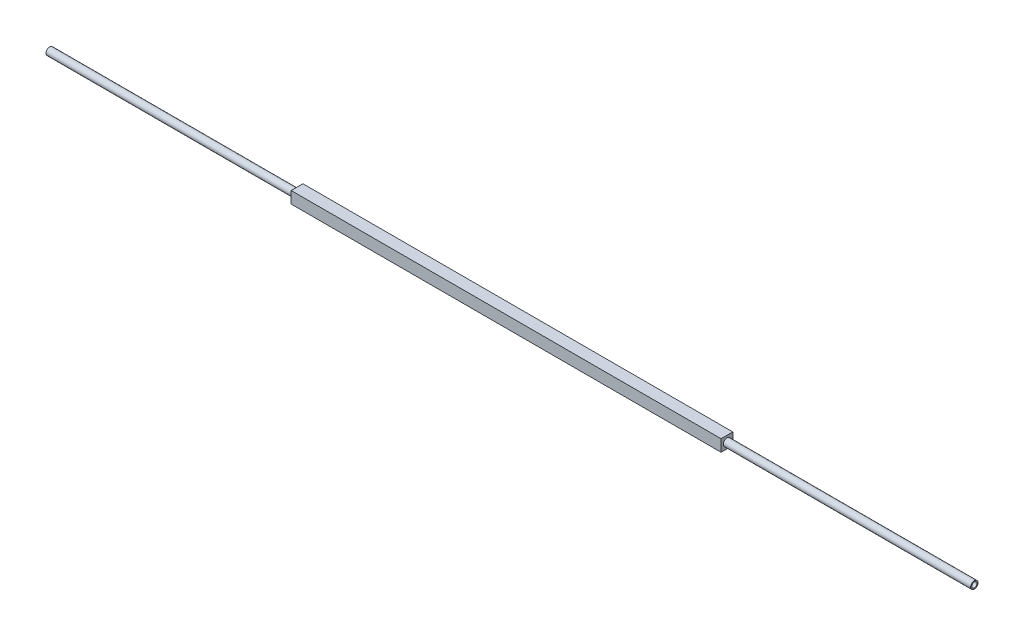
ISO-10303-21;
HEADER;
FILE_DESCRIPTION(('STEP AP214'),'2;1');
FILE_NAME('part.step','',(''),(''),'','','');
FILE_SCHEMA(('AUTOMOTIVE_DESIGN { 1 0 10303 214 1 1 1 1 }'));
ENDSEC;
DATA;
#1=APPLICATION_CONTEXT('core data for automotive mechanical design processes');
#2=APPLICATION_PROTOCOL_DEFINITION('international standard','automotive_design',2000,#1);
#3=PRODUCT_CONTEXT('',#1,'mechanical');
#4=PRODUCT('Part','Part','',(#3));
#5=PRODUCT_RELATED_PRODUCT_CATEGORY('part','',(#4));
#6=PRODUCT_DEFINITION_FORMATION('','',#4);
#7=PRODUCT_DEFINITION_CONTEXT('part definition',#1,'design');
#8=PRODUCT_DEFINITION('design','',#6,#7);
#9=PRODUCT_DEFINITION_SHAPE('','',#8);
#10=(LENGTH_UNIT() NAMED_UNIT(*) SI_UNIT(.MILLI.,.METRE.));
#11=(NAMED_UNIT(*) PLANE_ANGLE_UNIT() SI_UNIT($,.RADIAN.));
#12=(NAMED_UNIT(*) SI_UNIT($,.STERADIAN.) SOLID_ANGLE_UNIT());
#13=UNCERTAINTY_MEASURE_WITH_UNIT(LENGTH_MEASURE(1.E-05),#10,'distance_accuracy_value','');
#14=(GEOMETRIC_REPRESENTATION_CONTEXT(3) GLOBAL_UNCERTAINTY_ASSIGNED_CONTEXT((#13)) GLOBAL_UNIT_ASSIGNED_CONTEXT((#10,
#11,#12)) REPRESENTATION_CONTEXT('',''));
#15=CARTESIAN_POINT('',(0.,0.,0.));
#16=DIRECTION('',(0.,0.,1.));
#17=DIRECTION('',(1.,0.,0.));
#18=AXIS2_PLACEMENT_3D('',#15,#16,#17);
#19=CARTESIAN_POINT('',(-116.205,0.,0.));
#20=DIRECTION('',(0.,0.,1.));
#21=DIRECTION('',(1.,0.,0.));
#22=AXIS2_PLACEMENT_3D('',#19,#20,#21);
#23=PLANE('',#22);
#24=DIRECTION('',(1.,0.,0.));
#25=VECTOR('',#24,1.);
#26=CARTESIAN_POINT('',(-116.205,0.,0.));
#27=LINE('',#26,#25);
#28=CARTESIAN_POINT('',(-116.205,0.,0.));
#29=VERTEX_POINT('',#28);
#30=CARTESIAN_POINT('',(116.205,0.,0.));
#31=VERTEX_POINT('',#30);
#32=EDGE_CURVE('E71',#29,#31,#27,.T.);
#33=ORIENTED_EDGE('',*,*,#32,.T.);
#34=DIRECTION('',(0.,-1.,0.));
#35=VECTOR('',#34,1.);
#36=CARTESIAN_POINT('',(116.205,0.,0.));
#37=LINE('',#36,#35);
#38=CARTESIAN_POINT('',(116.205,6.35,0.));
#39=VERTEX_POINT('',#38);
#40=EDGE_CURVE('E74',#39,#31,#37,.T.);
#41=ORIENTED_EDGE('',*,*,#40,.F.);
#42=DIRECTION('',(1.,0.,0.));
#43=VECTOR('',#42,1.);
#44=CARTESIAN_POINT('',(-116.205,6.35,0.));
#45=LINE('',#44,#43);
#46=CARTESIAN_POINT('',(-116.205,6.35,0.));
#47=VERTEX_POINT('',#46);
#48=EDGE_CURVE('E39',#47,#39,#45,.T.);
#49=ORIENTED_EDGE('',*,*,#48,.F.);
#50=DIRECTION('',(0.,-1.,0.));
#51=VECTOR('',#50,1.);
#52=CARTESIAN_POINT('',(-116.205,0.,0.));
#53=LINE('',#52,#51);
#54=EDGE_CURVE('E75',#47,#29,#53,.T.);
#55=ORIENTED_EDGE('',*,*,#54,.T.);
#56=EDGE_LOOP('',(#33,#41,#49,#55));
#57=FACE_BOUND('',#56,.T.);
#58=ADVANCED_FACE('F31',(#57),#23,.T.);
#59=CARTESIAN_POINT('',(-116.205,6.35,0.));
#60=DIRECTION('',(0.,1.,0.));
#61=DIRECTION('',(0.,0.,1.));
#62=AXIS2_PLACEMENT_3D('',#59,#60,#61);
#63=PLANE('',#62);
#64=ORIENTED_EDGE('',*,*,#48,.T.);
#65=DIRECTION('',(0.,0.,1.));
#66=VECTOR('',#65,1.);
#67=CARTESIAN_POINT('',(116.205,6.35,0.));
#68=LINE('',#67,#66);
#69=CARTESIAN_POINT('',(116.205,6.35,-6.35));
#70=VERTEX_POINT('',#69);
#71=EDGE_CURVE('E91',#70,#39,#68,.T.);
#72=ORIENTED_EDGE('',*,*,#71,.F.);
#73=DIRECTION('',(1.,0.,0.));
#74=VECTOR('',#73,1.);
#75=CARTESIAN_POINT('',(-116.205,6.35,-6.35));
#76=LINE('',#75,#74);
#77=CARTESIAN_POINT('',(-116.205,6.35,-6.35));
#78=VERTEX_POINT('',#77);
#79=EDGE_CURVE('E54',#78,#70,#76,.T.);
#80=ORIENTED_EDGE('',*,*,#79,.F.);
#81=DIRECTION('',(0.,0.,1.));
#82=VECTOR('',#81,1.);
#83=CARTESIAN_POINT('',(-116.205,6.35,0.));
#84=LINE('',#83,#82);
#85=EDGE_CURVE('E80',#78,#47,#84,.T.);
#86=ORIENTED_EDGE('',*,*,#85,.T.);
#87=EDGE_LOOP('',(#64,#72,#80,#86));
#88=FACE_BOUND('',#87,.T.);
#89=ADVANCED_FACE('F111',(#88),#63,.T.);
#90=CARTESIAN_POINT('',(-116.205,0.,-6.35));
#91=DIRECTION('',(0.,0.,-1.));
#92=DIRECTION('',(-1.,0.,0.));
#93=AXIS2_PLACEMENT_3D('',#90,#91,#92);
#94=PLANE('',#93);
#95=ORIENTED_EDGE('',*,*,#79,.T.);
#96=DIRECTION('',(0.,1.,0.));
#97=VECTOR('',#96,1.);
#98=CARTESIAN_POINT('',(116.205,0.,-6.35));
#99=LINE('',#98,#97);
#100=CARTESIAN_POINT('',(116.205,0.,-6.35));
#101=VERTEX_POINT('',#100);
#102=EDGE_CURVE('E87',#101,#70,#99,.T.);
#103=ORIENTED_EDGE('',*,*,#102,.F.);
#104=DIRECTION('',(1.,0.,0.));
#105=VECTOR('',#104,1.);
#106=CARTESIAN_POINT('',(-116.205,0.,-6.35));
#107=LINE('',#106,#105);
#108=CARTESIAN_POINT('',(-116.205,0.,-6.35));
#109=VERTEX_POINT('',#108);
#110=EDGE_CURVE('E79',#109,#101,#107,.T.);
#111=ORIENTED_EDGE('',*,*,#110,.F.);
#112=DIRECTION('',(0.,1.,0.));
#113=VECTOR('',#112,1.);
#114=CARTESIAN_POINT('',(-116.205,0.,-6.35));
#115=LINE('',#114,#113);
#116=EDGE_CURVE('E102',#109,#78,#115,.T.);
#117=ORIENTED_EDGE('',*,*,#116,.T.);
#118=EDGE_LOOP('',(#95,#103,#111,#117));
#119=FACE_BOUND('',#118,.T.);
#120=ADVANCED_FACE('F108',(#119),#94,.T.);
#121=CARTESIAN_POINT('',(-116.205,0.,0.));
#122=DIRECTION('',(0.,-1.,0.));
#123=DIRECTION('',(0.,0.,-1.));
#124=AXIS2_PLACEMENT_3D('',#121,#122,#123);
#125=PLANE('',#124);
#126=ORIENTED_EDGE('',*,*,#110,.T.);
#127=DIRECTION('',(0.,0.,-1.));
#128=VECTOR('',#127,1.);
#129=CARTESIAN_POINT('',(116.205,0.,0.));
#130=LINE('',#129,#128);
#131=EDGE_CURVE('E82',#31,#101,#130,.T.);
#132=ORIENTED_EDGE('',*,*,#131,.F.);
#133=ORIENTED_EDGE('',*,*,#32,.F.);
#134=DIRECTION('',(0.,0.,-1.));
#135=VECTOR('',#134,1.);
#136=CARTESIAN_POINT('',(-116.205,0.,0.));
#137=LINE('',#136,#135);
#138=EDGE_CURVE('E100',#29,#109,#137,.T.);
#139=ORIENTED_EDGE('',*,*,#138,.T.);
#140=EDGE_LOOP('',(#126,#132,#133,#139));
#141=FACE_BOUND('',#140,.T.);
#142=ADVANCED_FACE('F83',(#141),#125,.T.);
#143=CARTESIAN_POINT('',(-116.205,6.35,0.));
#144=DIRECTION('',(-1.,0.,0.));
#145=DIRECTION('',(0.,0.,1.));
#146=AXIS2_PLACEMENT_3D('',#143,#144,#145);
#147=PLANE('',#146);
#148=CARTESIAN_POINT('',(-116.205,3.175,-3.175));
#149=DIRECTION('',(-1.,0.,0.));
#150=DIRECTION('',(0.,0.,1.));
#151=AXIS2_PLACEMENT_3D('',#148,#149,#150);
#152=CIRCLE('',#151,1.9939);
#153=CARTESIAN_POINT('',(-116.205,3.175,-5.1689));
#154=VERTEX_POINT('',#153);
#155=EDGE_CURVE('E11',#154,#154,#152,.T.);
#156=ORIENTED_EDGE('',*,*,#155,.F.);
#157=EDGE_LOOP('',(#156));
#158=FACE_BOUND('',#157,.T.);
#159=ORIENTED_EDGE('',*,*,#54,.F.);
#160=ORIENTED_EDGE('',*,*,#85,.F.);
#161=ORIENTED_EDGE('',*,*,#116,.F.);
#162=ORIENTED_EDGE('',*,*,#138,.F.);
#163=EDGE_LOOP('',(#159,#160,#161,#162));
#164=FACE_BOUND('',#163,.T.);
#165=ADVANCED_FACE('F113',(#158,#164),#147,.T.);
#166=CARTESIAN_POINT('',(116.205,6.35,0.));
#167=DIRECTION('',(-1.,0.,0.));
#168=DIRECTION('',(0.,0.,1.));
#169=AXIS2_PLACEMENT_3D('',#166,#167,#168);
#170=PLANE('',#169);
#171=CARTESIAN_POINT('',(116.205,3.175,-3.175));
#172=DIRECTION('',(-1.,0.,0.));
#173=DIRECTION('',(0.,0.,1.));
#174=AXIS2_PLACEMENT_3D('',#171,#172,#173);
#175=CIRCLE('',#174,1.9939);
#176=CARTESIAN_POINT('',(116.205,3.175,-5.1689));
#177=VERTEX_POINT('',#176);
#178=EDGE_CURVE('E34',#177,#177,#175,.T.);
#179=ORIENTED_EDGE('',*,*,#178,.T.);
#180=EDGE_LOOP('',(#179));
#181=FACE_BOUND('',#180,.T.);
#182=ORIENTED_EDGE('',*,*,#40,.T.);
#183=ORIENTED_EDGE('',*,*,#131,.T.);
#184=ORIENTED_EDGE('',*,*,#102,.T.);
#185=ORIENTED_EDGE('',*,*,#71,.T.);
#186=EDGE_LOOP('',(#182,#183,#184,#185));
#187=FACE_BOUND('',#186,.T.);
#188=ADVANCED_FACE('F90',(#181,#187),#170,.F.);
#189=CARTESIAN_POINT('',(-249.936,3.175,-3.175));
#190=DIRECTION('',(1.,0.,0.));
#191=DIRECTION('',(0.,0.,-1.));
#192=AXIS2_PLACEMENT_3D('',#189,#190,#191);
#193=CYLINDRICAL_SURFACE('',#192,1.9939);
#194=CARTESIAN_POINT('',(249.936,3.175,-3.175));
#195=DIRECTION('',(1.,0.,0.));
#196=DIRECTION('',(0.,0.,-1.));
#197=AXIS2_PLACEMENT_3D('',#194,#195,#196);
#198=CIRCLE('',#197,1.9939);
#199=CARTESIAN_POINT('',(249.936,3.175,-5.1689));
#200=VERTEX_POINT('',#199);
#201=EDGE_CURVE('E212',#200,#200,#198,.T.);
#202=CARTESIAN_POINT('',(249.936,3.175,-5.1689));
#203=CARTESIAN_POINT('',(248.54296875,3.175,-5.1689));
#204=CARTESIAN_POINT('',(247.1499375,3.175,-5.1689));
#205=CARTESIAN_POINT('',(244.363875,3.175,-5.1689));
#206=CARTESIAN_POINT('',(242.97084375,3.175,-5.1689));
#207=CARTESIAN_POINT('',(240.18478125,3.175,-5.1689));
#208=CARTESIAN_POINT('',(238.79175,3.175,-5.1689));
#209=CARTESIAN_POINT('',(236.0056875,3.175,-5.1689));
#210=CARTESIAN_POINT('',(234.61265625,3.175,-5.1689));
#211=CARTESIAN_POINT('',(231.82659375,3.175,-5.1689));
#212=CARTESIAN_POINT('',(230.4335625,3.175,-5.1689));
#213=CARTESIAN_POINT('',(227.6475,3.175,-5.1689));
#214=CARTESIAN_POINT('',(226.25446875,3.175,-5.1689));
#215=CARTESIAN_POINT('',(223.46840625,3.175,-5.1689));
#216=CARTESIAN_POINT('',(222.075375,3.175,-5.1689));
#217=CARTESIAN_POINT('',(219.2893125,3.175,-5.1689));
#218=CARTESIAN_POINT('',(217.89628125,3.175,-5.1689));
#219=CARTESIAN_POINT('',(215.11021875,3.175,-5.1689));
#220=CARTESIAN_POINT('',(213.7171875,3.175,-5.1689));
#221=CARTESIAN_POINT('',(210.931125,3.175,-5.1689));
#222=CARTESIAN_POINT('',(209.53809375,3.175,-5.1689));
#223=CARTESIAN_POINT('',(206.75203125,3.175,-5.1689));
#224=CARTESIAN_POINT('',(205.359,3.175,-5.1689));
#225=CARTESIAN_POINT('',(202.5729375,3.175,-5.1689));
#226=CARTESIAN_POINT('',(201.17990625,3.175,-5.1689));
#227=CARTESIAN_POINT('',(198.39384375,3.175,-5.1689));
#228=CARTESIAN_POINT('',(197.0008125,3.175,-5.1689));
#229=CARTESIAN_POINT('',(194.21475,3.175,-5.1689));
#230=CARTESIAN_POINT('',(192.82171875,3.175,-5.1689));
#231=CARTESIAN_POINT('',(190.03565625,3.175,-5.1689));
#232=CARTESIAN_POINT('',(188.642625,3.175,-5.1689));
#233=CARTESIAN_POINT('',(185.8565625,3.175,-5.1689));
#234=CARTESIAN_POINT('',(184.46353125,3.175,-5.1689));
#235=CARTESIAN_POINT('',(181.67746875,3.175,-5.1689));
#236=CARTESIAN_POINT('',(180.2844375,3.175,-5.1689));
#237=CARTESIAN_POINT('',(177.498375,3.175,-5.1689));
#238=CARTESIAN_POINT('',(176.10534375,3.175,-5.1689));
#239=CARTESIAN_POINT('',(173.31928125,3.175,-5.1689));
#240=CARTESIAN_POINT('',(171.92625,3.175,-5.1689));
#241=CARTESIAN_POINT('',(169.1401875,3.175,-5.1689));
#242=CARTESIAN_POINT('',(167.74715625,3.175,-5.1689));
#243=CARTESIAN_POINT('',(164.96109375,3.175,-5.1689));
#244=CARTESIAN_POINT('',(163.5680625,3.175,-5.1689));
#245=CARTESIAN_POINT('',(160.782,3.175,-5.1689));
#246=CARTESIAN_POINT('',(159.38896875,3.175,-5.1689));
#247=CARTESIAN_POINT('',(156.60290625,3.175,-5.1689));
#248=CARTESIAN_POINT('',(155.209875,3.175,-5.1689));
#249=CARTESIAN_POINT('',(152.4238125,3.175,-5.1689));
#250=CARTESIAN_POINT('',(151.03078125,3.175,-5.1689));
#251=CARTESIAN_POINT('',(148.24471875,3.175,-5.1689));
#252=CARTESIAN_POINT('',(146.8516875,3.175,-5.1689));
#253=CARTESIAN_POINT('',(144.065625,3.175,-5.1689));
#254=CARTESIAN_POINT('',(142.67259375,3.175,-5.1689));
#255=CARTESIAN_POINT('',(139.88653125,3.175,-5.1689));
#256=CARTESIAN_POINT('',(138.4935,3.175,-5.1689));
#257=CARTESIAN_POINT('',(135.7074375,3.175,-5.1689));
#258=CARTESIAN_POINT('',(134.31440625,3.175,-5.1689));
#259=CARTESIAN_POINT('',(131.52834375,3.175,-5.1689));
#260=CARTESIAN_POINT('',(130.1353125,3.175,-5.1689));
#261=CARTESIAN_POINT('',(127.34925,3.175,-5.1689));
#262=CARTESIAN_POINT('',(125.95621875,3.175,-5.1689));
#263=CARTESIAN_POINT('',(123.17015625,3.175,-5.1689));
#264=CARTESIAN_POINT('',(121.777125,3.175,-5.1689));
#265=CARTESIAN_POINT('',(118.9910625,3.175,-5.1689));
#266=CARTESIAN_POINT('',(117.59803125,3.175,-5.1689));
#267=CARTESIAN_POINT('',(116.205,3.175,-5.1689));
#268=B_SPLINE_CURVE_WITH_KNOTS('',3,(#202,#203,#204,#205,#206,#207,#208,#209,#210,#211,#212,
#213,#214,#215,#216,#217,#218,#219,#220,#221,#222,#223,#224,#225,#226,#227,#228,#229,#230,#231,
#232,#233,#234,#235,#236,#237,#238,#239,#240,#241,#242,#243,#244,#245,#246,#247,#248,#249,#250,
#251,#252,#253,#254,#255,#256,#257,#258,#259,#260,#261,#262,#263,#264,#265,#266,#267),
.UNSPECIFIED.,.F.,.F.,(4,2,2,2,2,2,2,2,2,2,2,2,2,2,2,2,2,2,2,2,2,2,2,2,2,2,2,2,2,2,2,2,4),(0.,
4.17909374999997,8.3581875,12.53728125,16.716375,20.89546875,25.0745625,29.25365625,33.43275,
37.61184375,41.7909375,45.97003125,50.149125,54.32821875,58.5073125,62.68640625,66.8655,
71.0445937499999,75.2236875,79.4027812499999,83.581875,87.7609687499999,91.9400625,
96.1191562499999,100.29825,104.47734375,108.6564375,112.83553125,117.014625,121.19371875,
125.3728125,129.55190625,133.731),.UNSPECIFIED.);
#269=EDGE_CURVE('BSEAM121',#200,#177,#268,.T.);
#270=ORIENTED_EDGE('',*,*,#201,.F.);
#271=ORIENTED_EDGE('',*,*,#178,.F.);
#272=ORIENTED_EDGE('',*,*,#269,.T.);
#273=ORIENTED_EDGE('',*,*,#269,.F.);
#274=EDGE_LOOP('',(#270,#272,#271,#273));
#275=FACE_BOUND('',#274,.T.);
#276=ADVANCED_FACE('F121',(#275),#193,.T.);
#277=CARTESIAN_POINT('',(249.936,3.175,-3.175));
#278=DIRECTION('',(1.,0.,0.));
#279=DIRECTION('',(0.,0.,-1.));
#280=AXIS2_PLACEMENT_3D('',#277,#278,#279);
#281=PLANE('',#280);
#282=ORIENTED_EDGE('',*,*,#201,.T.);
#283=EDGE_LOOP('',(#282));
#284=FACE_BOUND('',#283,.T.);
#285=CARTESIAN_POINT('',(249.936,3.175,-3.175));
#286=DIRECTION('',(1.,0.,0.));
#287=DIRECTION('',(0.,0.,-1.));
#288=AXIS2_PLACEMENT_3D('',#285,#286,#287);
#289=CIRCLE('',#288,1.397);
#290=CARTESIAN_POINT('',(249.936,3.175,-4.572));
#291=VERTEX_POINT('',#290);
#292=EDGE_CURVE('E208',#291,#291,#289,.T.);
#293=ORIENTED_EDGE('',*,*,#292,.F.);
#294=EDGE_LOOP('',(#293));
#295=FACE_BOUND('',#294,.T.);
#296=ADVANCED_FACE('F161',(#284,#295),#281,.T.);
#297=CARTESIAN_POINT('',(-249.936,3.175,-3.175));
#298=DIRECTION('',(1.,0.,0.));
#299=DIRECTION('',(0.,0.,-1.));
#300=AXIS2_PLACEMENT_3D('',#297,#298,#299);
#301=CIRCLE('',#300,1.9939);
#302=CARTESIAN_POINT('',(-249.936,3.175,-5.1689));
#303=VERTEX_POINT('',#302);
#304=EDGE_CURVE('E94',#303,#303,#301,.T.);
#305=CARTESIAN_POINT('',(-116.205,3.175,-5.1689));
#306=CARTESIAN_POINT('',(-117.59803125,3.175,-5.1689));
#307=CARTESIAN_POINT('',(-118.9910625,3.175,-5.1689));
#308=CARTESIAN_POINT('',(-121.777125,3.175,-5.1689));
#309=CARTESIAN_POINT('',(-123.17015625,3.175,-5.1689));
#310=CARTESIAN_POINT('',(-125.95621875,3.175,-5.1689));
#311=CARTESIAN_POINT('',(-127.34925,3.175,-5.1689));
#312=CARTESIAN_POINT('',(-130.1353125,3.175,-5.1689));
#313=CARTESIAN_POINT('',(-131.52834375,3.175,-5.1689));
#314=CARTESIAN_POINT('',(-134.31440625,3.175,-5.1689));
#315=CARTESIAN_POINT('',(-135.7074375,3.175,-5.1689));
#316=CARTESIAN_POINT('',(-138.4935,3.175,-5.1689));
#317=CARTESIAN_POINT('',(-139.88653125,3.175,-5.1689));
#318=CARTESIAN_POINT('',(-142.67259375,3.175,-5.1689));
#319=CARTESIAN_POINT('',(-144.065625,3.175,-5.1689));
#320=CARTESIAN_POINT('',(-146.8516875,3.175,-5.1689));
#321=CARTESIAN_POINT('',(-148.24471875,3.175,-5.1689));
#322=CARTESIAN_POINT('',(-151.03078125,3.175,-5.1689));
#323=CARTESIAN_POINT('',(-152.4238125,3.175,-5.1689));
#324=CARTESIAN_POINT('',(-155.209875,3.175,-5.1689));
#325=CARTESIAN_POINT('',(-156.60290625,3.175,-5.1689));
#326=CARTESIAN_POINT('',(-159.38896875,3.175,-5.1689));
#327=CARTESIAN_POINT('',(-160.782,3.175,-5.1689));
#328=CARTESIAN_POINT('',(-163.5680625,3.175,-5.1689));
#329=CARTESIAN_POINT('',(-164.96109375,3.175,-5.1689));
#330=CARTESIAN_POINT('',(-167.74715625,3.175,-5.1689));
#331=CARTESIAN_POINT('',(-169.1401875,3.175,-5.1689));
#332=CARTESIAN_POINT('',(-171.92625,3.175,-5.1689));
#333=CARTESIAN_POINT('',(-173.31928125,3.175,-5.1689));
#334=CARTESIAN_POINT('',(-176.10534375,3.175,-5.1689));
#335=CARTESIAN_POINT('',(-177.498375,3.175,-5.1689));
#336=CARTESIAN_POINT('',(-180.2844375,3.175,-5.1689));
#337=CARTESIAN_POINT('',(-181.67746875,3.175,-5.1689));
#338=CARTESIAN_POINT('',(-184.46353125,3.175,-5.1689));
#339=CARTESIAN_POINT('',(-185.8565625,3.175,-5.1689));
#340=CARTESIAN_POINT('',(-188.642625,3.175,-5.1689));
#341=CARTESIAN_POINT('',(-190.03565625,3.175,-5.1689));
#342=CARTESIAN_POINT('',(-192.82171875,3.175,-5.1689));
#343=CARTESIAN_POINT('',(-194.21475,3.175,-5.1689));
#344=CARTESIAN_POINT('',(-197.0008125,3.175,-5.1689));
#345=CARTESIAN_POINT('',(-198.39384375,3.175,-5.1689));
#346=CARTESIAN_POINT('',(-201.17990625,3.175,-5.1689));
#347=CARTESIAN_POINT('',(-202.5729375,3.175,-5.1689));
#348=CARTESIAN_POINT('',(-205.359,3.175,-5.1689));
#349=CARTESIAN_POINT('',(-206.75203125,3.175,-5.1689));
#350=CARTESIAN_POINT('',(-209.53809375,3.175,-5.1689));
#351=CARTESIAN_POINT('',(-210.931125,3.175,-5.1689));
#352=CARTESIAN_POINT('',(-213.7171875,3.175,-5.1689));
#353=CARTESIAN_POINT('',(-215.11021875,3.175,-5.1689));
#354=CARTESIAN_POINT('',(-217.89628125,3.175,-5.1689));
#355=CARTESIAN_POINT('',(-219.2893125,3.175,-5.1689));
#356=CARTESIAN_POINT('',(-222.075375,3.175,-5.1689));
#357=CARTESIAN_POINT('',(-223.46840625,3.175,-5.1689));
#358=CARTESIAN_POINT('',(-226.25446875,3.175,-5.1689));
#359=CARTESIAN_POINT('',(-227.6475,3.175,-5.1689));
#360=CARTESIAN_POINT('',(-230.4335625,3.175,-5.1689));
#361=CARTESIAN_POINT('',(-231.82659375,3.175,-5.1689));
#362=CARTESIAN_POINT('',(-234.61265625,3.175,-5.1689));
#363=CARTESIAN_POINT('',(-236.0056875,3.175,-5.1689));
#364=CARTESIAN_POINT('',(-238.79175,3.175,-5.1689));
#365=CARTESIAN_POINT('',(-240.18478125,3.175,-5.1689));
#366=CARTESIAN_POINT('',(-242.97084375,3.175,-5.1689));
#367=CARTESIAN_POINT('',(-244.363875,3.175,-5.1689));
#368=CARTESIAN_POINT('',(-247.1499375,3.175,-5.1689));
#369=CARTESIAN_POINT('',(-248.54296875,3.175,-5.1689));
#370=CARTESIAN_POINT('',(-249.936,3.175,-5.1689));
#371=B_SPLINE_CURVE_WITH_KNOTS('',3,(#305,#306,#307,#308,#309,#310,#311,#312,#313,#314,#315,
#316,#317,#318,#319,#320,#321,#322,#323,#324,#325,#326,#327,#328,#329,#330,#331,#332,#333,#334,
#335,#336,#337,#338,#339,#340,#341,#342,#343,#344,#345,#346,#347,#348,#349,#350,#351,#352,#353,
#354,#355,#356,#357,#358,#359,#360,#361,#362,#363,#364,#365,#366,#367,#368,#369,#370),
.UNSPECIFIED.,.F.,.F.,(4,2,2,2,2,2,2,2,2,2,2,2,2,2,2,2,2,2,2,2,2,2,2,2,2,2,2,2,2,2,2,2,4),(0.,
4.17909375,8.3581875,12.53728125,16.716375,20.89546875,25.0745625,29.25365625,33.43275,
37.61184375,41.7909375,45.97003125,50.149125,54.32821875,58.5073125,62.68640625,66.8655,
71.04459375,75.2236875,79.40278125,83.581875,87.76096875,91.9400625,96.11915625,100.29825,
104.47734375,108.6564375,112.83553125,117.014625,121.19371875,125.3728125,129.55190625,133.731),.UNSPECIFIED.);
#372=EDGE_CURVE('BSEAM164',#154,#303,#371,.T.);
#373=ORIENTED_EDGE('',*,*,#155,.T.);
#374=ORIENTED_EDGE('',*,*,#304,.T.);
#375=ORIENTED_EDGE('',*,*,#372,.T.);
#376=ORIENTED_EDGE('',*,*,#372,.F.);
#377=EDGE_LOOP('',(#373,#375,#374,#376));
#378=FACE_BOUND('',#377,.T.);
#379=ADVANCED_FACE('F164',(#378),#193,.T.);
#380=CARTESIAN_POINT('',(-249.936,3.175,-3.175));
#381=DIRECTION('',(1.,0.,0.));
#382=DIRECTION('',(0.,0.,-1.));
#383=AXIS2_PLACEMENT_3D('',#380,#381,#382);
#384=PLANE('',#383);
#385=CARTESIAN_POINT('',(-249.936,3.175,-3.175));
#386=DIRECTION('',(1.,0.,0.));
#387=DIRECTION('',(0.,0.,-1.));
#388=AXIS2_PLACEMENT_3D('',#385,#386,#387);
#389=CIRCLE('',#388,1.397);
#390=CARTESIAN_POINT('',(-249.936,3.175,-4.572));
#391=VERTEX_POINT('',#390);
#392=EDGE_CURVE('E211',#391,#391,#389,.T.);
#393=ORIENTED_EDGE('',*,*,#392,.T.);
#394=EDGE_LOOP('',(#393));
#395=FACE_BOUND('',#394,.T.);
#396=ORIENTED_EDGE('',*,*,#304,.F.);
#397=EDGE_LOOP('',(#396));
#398=FACE_BOUND('',#397,.T.);
#399=ADVANCED_FACE('F181',(#395,#398),#384,.F.);
#400=CARTESIAN_POINT('',(-116.205,3.175,-3.175));
#401=DIRECTION('',(1.,0.,0.));
#402=DIRECTION('',(0.,0.,-1.));
#403=AXIS2_PLACEMENT_3D('',#400,#401,#402);
#404=CYLINDRICAL_SURFACE('',#403,1.397);
#405=ORIENTED_EDGE('',*,*,#292,.T.);
#406=EDGE_LOOP('',(#405));
#407=FACE_BOUND('',#406,.T.);
#408=ORIENTED_EDGE('',*,*,#392,.F.);
#409=EDGE_LOOP('',(#408));
#410=FACE_BOUND('',#409,.T.);
#411=ADVANCED_FACE('F190',(#407,#410),#404,.F.);
#412=CLOSED_SHELL('',(#58,#89,#120,#142,#165,#188,#276,#296,#379,#399,#411));
#413=MANIFOLD_SOLID_BREP('B2',#412);
#414=ADVANCED_BREP_SHAPE_REPRESENTATION('',(#18,#413),#14);
#415=SHAPE_DEFINITION_REPRESENTATION(#9,#414);
ENDSEC;
END-ISO-10303-21;
